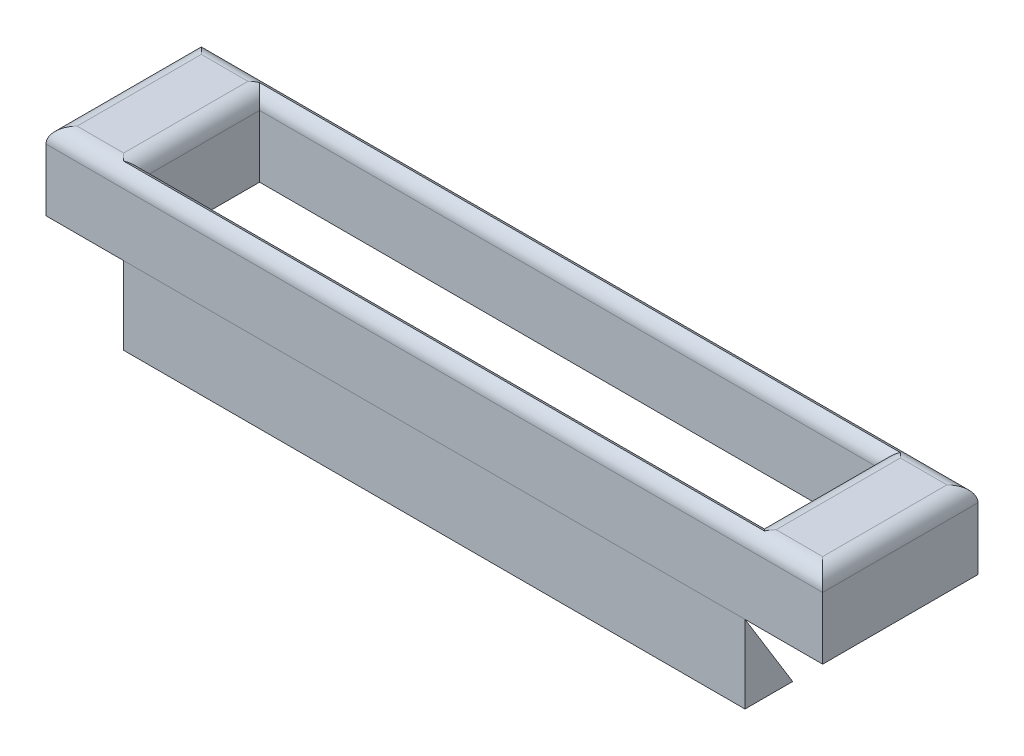
ISO-10303-21;
HEADER;
FILE_DESCRIPTION(('STEP AP214'),'2;1');
FILE_NAME('part.step','',(''),(''),'','','');
FILE_SCHEMA(('AUTOMOTIVE_DESIGN { 1 0 10303 214 1 1 1 1 }'));
ENDSEC;
DATA;
#1=APPLICATION_CONTEXT('core data for automotive mechanical design processes');
#2=APPLICATION_PROTOCOL_DEFINITION('international standard','automotive_design',2000,#1);
#3=PRODUCT_CONTEXT('',#1,'mechanical');
#4=PRODUCT('Part','Part','',(#3));
#5=PRODUCT_RELATED_PRODUCT_CATEGORY('part','',(#4));
#6=PRODUCT_DEFINITION_FORMATION('','',#4);
#7=PRODUCT_DEFINITION_CONTEXT('part definition',#1,'design');
#8=PRODUCT_DEFINITION('design','',#6,#7);
#9=PRODUCT_DEFINITION_SHAPE('','',#8);
#10=(LENGTH_UNIT() NAMED_UNIT(*) SI_UNIT(.MILLI.,.METRE.));
#11=(NAMED_UNIT(*) PLANE_ANGLE_UNIT() SI_UNIT($,.RADIAN.));
#12=(NAMED_UNIT(*) SI_UNIT($,.STERADIAN.) SOLID_ANGLE_UNIT());
#13=UNCERTAINTY_MEASURE_WITH_UNIT(LENGTH_MEASURE(1.E-05),#10,'distance_accuracy_value','');
#14=(GEOMETRIC_REPRESENTATION_CONTEXT(3) GLOBAL_UNCERTAINTY_ASSIGNED_CONTEXT((#13)) GLOBAL_UNIT_ASSIGNED_CONTEXT((#10,
#11,#12)) REPRESENTATION_CONTEXT('',''));
#15=CARTESIAN_POINT('',(0.,0.,0.));
#16=DIRECTION('',(0.,0.,1.));
#17=DIRECTION('',(1.,0.,0.));
#18=AXIS2_PLACEMENT_3D('',#15,#16,#17);
#19=CARTESIAN_POINT('',(0.,10.,0.));
#20=DIRECTION('',(0.,-1.,0.));
#21=DIRECTION('',(0.,0.,-1.));
#22=AXIS2_PLACEMENT_3D('',#19,#20,#21);
#23=PLANE('',#22);
#24=DIRECTION('',(0.,0.,1.));
#25=VECTOR('',#24,1.);
#26=CARTESIAN_POINT('',(-48.,10.,1.19533527696792));
#27=LINE('',#26,#25);
#28=CARTESIAN_POINT('',(-48.,10.,-16.8046647230321));
#29=VERTEX_POINT('',#28);
#30=CARTESIAN_POINT('',(-48.,10.,-0.804664723032077));
#31=VERTEX_POINT('',#30);
#32=EDGE_CURVE('E231',#29,#31,#27,.T.);
#33=ORIENTED_EDGE('',*,*,#32,.T.);
#34=DIRECTION('',(1.,0.,0.));
#35=VECTOR('',#34,1.);
#36=CARTESIAN_POINT('',(50.,10.,-0.804664723032084));
#37=LINE('',#36,#35);
#38=CARTESIAN_POINT('',(-42.,10.,-0.80466472303208));
#39=VERTEX_POINT('',#38);
#40=EDGE_CURVE('E233',#31,#39,#37,.T.);
#41=ORIENTED_EDGE('',*,*,#40,.T.);
#42=DIRECTION('',(0.,0.,1.));
#43=VECTOR('',#42,1.);
#44=CARTESIAN_POINT('',(-42.,10.,0.));
#45=LINE('',#44,#43);
#46=CARTESIAN_POINT('',(-42.,10.,-16.8046647230321));
#47=VERTEX_POINT('',#46);
#48=EDGE_CURVE('E227',#39,#47,#45,.F.);
#49=ORIENTED_EDGE('',*,*,#48,.T.);
#50=DIRECTION('',(-1.,0.,0.));
#51=VECTOR('',#50,1.);
#52=CARTESIAN_POINT('',(-50.,10.,-16.8046647230321));
#53=LINE('',#52,#51);
#54=EDGE_CURVE('E229',#47,#29,#53,.T.);
#55=ORIENTED_EDGE('',*,*,#54,.T.);
#56=EDGE_LOOP('',(#33,#41,#49,#55));
#57=FACE_BOUND('',#56,.T.);
#58=ADVANCED_FACE('F43',(#57),#23,.F.);
#59=CARTESIAN_POINT('',(50.,-10.,1.19533527696792));
#60=DIRECTION('',(1.,0.,0.));
#61=DIRECTION('',(0.,0.,-1.));
#62=AXIS2_PLACEMENT_3D('',#59,#60,#61);
#63=PLANE('',#62);
#64=DIRECTION('',(0.,1.,0.));
#65=VECTOR('',#64,1.);
#66=CARTESIAN_POINT('',(50.,-10.,-18.8046647230321));
#67=LINE('',#66,#65);
#68=CARTESIAN_POINT('',(50.,0.,-18.8046647230321));
#69=VERTEX_POINT('',#68);
#70=CARTESIAN_POINT('',(50.,8.,-18.8046647230321));
#71=VERTEX_POINT('',#70);
#72=EDGE_CURVE('E195',#69,#71,#67,.T.);
#73=ORIENTED_EDGE('',*,*,#72,.T.);
#74=DIRECTION('',(0.,0.,-1.));
#75=VECTOR('',#74,1.);
#76=CARTESIAN_POINT('',(50.,8.,1.19533527696792));
#77=LINE('',#76,#75);
#78=CARTESIAN_POINT('',(50.,8.,1.19533527696792));
#79=VERTEX_POINT('',#78);
#80=EDGE_CURVE('E180',#71,#79,#77,.F.);
#81=ORIENTED_EDGE('',*,*,#80,.T.);
#82=DIRECTION('',(0.,1.,0.));
#83=VECTOR('',#82,1.);
#84=CARTESIAN_POINT('',(50.,-10.,1.19533527696792));
#85=LINE('',#84,#83);
#86=CARTESIAN_POINT('',(50.,0.,1.19533527696792));
#87=VERTEX_POINT('',#86);
#88=EDGE_CURVE('E209',#87,#79,#85,.T.);
#89=ORIENTED_EDGE('',*,*,#88,.F.);
#90=DIRECTION('',(0.,0.,1.));
#91=VECTOR('',#90,1.);
#92=CARTESIAN_POINT('',(50.,0.,1.19533527696792));
#93=LINE('',#92,#91);
#94=EDGE_CURVE('E206',#69,#87,#93,.T.);
#95=ORIENTED_EDGE('',*,*,#94,.F.);
#96=EDGE_LOOP('',(#73,#81,#89,#95));
#97=FACE_BOUND('',#96,.T.);
#98=ADVANCED_FACE('F289',(#97),#63,.T.);
#99=CARTESIAN_POINT('',(-50.,-10.,1.19533527696792));
#100=DIRECTION('',(0.,0.,1.));
#101=DIRECTION('',(1.,0.,0.));
#102=AXIS2_PLACEMENT_3D('',#99,#100,#101);
#103=PLANE('',#102);
#104=ORIENTED_EDGE('',*,*,#88,.T.);
#105=DIRECTION('',(1.,0.,0.));
#106=VECTOR('',#105,1.);
#107=CARTESIAN_POINT('',(-50.,8.,1.19533527696792));
#108=LINE('',#107,#106);
#109=CARTESIAN_POINT('',(-50.,8.,1.19533527696792));
#110=VERTEX_POINT('',#109);
#111=EDGE_CURVE('E236',#79,#110,#108,.F.);
#112=ORIENTED_EDGE('',*,*,#111,.T.);
#113=DIRECTION('',(0.,1.,0.));
#114=VECTOR('',#113,1.);
#115=CARTESIAN_POINT('',(-50.,-10.,1.19533527696792));
#116=LINE('',#115,#114);
#117=CARTESIAN_POINT('',(-50.,0.,1.19533527696792));
#118=VERTEX_POINT('',#117);
#119=EDGE_CURVE('E204',#118,#110,#116,.T.);
#120=ORIENTED_EDGE('',*,*,#119,.F.);
#121=DIRECTION('',(1.,0.,0.));
#122=VECTOR('',#121,1.);
#123=CARTESIAN_POINT('',(-72.3606797749979,0.,1.19533527696792));
#124=LINE('',#123,#122);
#125=EDGE_CURVE('E199',#118,#87,#124,.T.);
#126=ORIENTED_EDGE('',*,*,#125,.T.);
#127=EDGE_LOOP('',(#104,#112,#120,#126));
#128=FACE_BOUND('',#127,.T.);
#129=ADVANCED_FACE('F295',(#128),#103,.T.);
#130=CARTESIAN_POINT('',(-50.,-10.,1.19533527696792));
#131=DIRECTION('',(-1.,0.,0.));
#132=DIRECTION('',(0.,0.,1.));
#133=AXIS2_PLACEMENT_3D('',#130,#131,#132);
#134=PLANE('',#133);
#135=ORIENTED_EDGE('',*,*,#119,.T.);
#136=DIRECTION('',(0.,0.,1.));
#137=VECTOR('',#136,1.);
#138=CARTESIAN_POINT('',(-50.,8.,-18.8046647230321));
#139=LINE('',#138,#137);
#140=CARTESIAN_POINT('',(-50.,8.,-18.8046647230321));
#141=VERTEX_POINT('',#140);
#142=EDGE_CURVE('E239',#110,#141,#139,.F.);
#143=ORIENTED_EDGE('',*,*,#142,.T.);
#144=DIRECTION('',(0.,1.,0.));
#145=VECTOR('',#144,1.);
#146=CARTESIAN_POINT('',(-50.,-10.,-18.8046647230321));
#147=LINE('',#146,#145);
#148=CARTESIAN_POINT('',(-50.,0.,-18.8046647230321));
#149=VERTEX_POINT('',#148);
#150=EDGE_CURVE('E200',#149,#141,#147,.T.);
#151=ORIENTED_EDGE('',*,*,#150,.F.);
#152=DIRECTION('',(0.,0.,1.));
#153=VECTOR('',#152,1.);
#154=CARTESIAN_POINT('',(-50.,0.,1.19533527696792));
#155=LINE('',#154,#153);
#156=EDGE_CURVE('E210',#149,#118,#155,.T.);
#157=ORIENTED_EDGE('',*,*,#156,.T.);
#158=EDGE_LOOP('',(#135,#143,#151,#157));
#159=FACE_BOUND('',#158,.T.);
#160=ADVANCED_FACE('F298',(#159),#134,.T.);
#161=CARTESIAN_POINT('',(-50.,-10.,-18.8046647230321));
#162=DIRECTION('',(0.,0.,-1.));
#163=DIRECTION('',(-1.,0.,0.));
#164=AXIS2_PLACEMENT_3D('',#161,#162,#163);
#165=PLANE('',#164);
#166=ORIENTED_EDGE('',*,*,#150,.T.);
#167=DIRECTION('',(-1.,0.,0.));
#168=VECTOR('',#167,1.);
#169=CARTESIAN_POINT('',(50.,8.,-18.8046647230321));
#170=LINE('',#169,#168);
#171=EDGE_CURVE('E241',#141,#71,#170,.F.);
#172=ORIENTED_EDGE('',*,*,#171,.T.);
#173=ORIENTED_EDGE('',*,*,#72,.F.);
#174=DIRECTION('',(1.,0.,0.));
#175=VECTOR('',#174,1.);
#176=CARTESIAN_POINT('',(-72.3606797749979,0.,-18.8046647230321));
#177=LINE('',#176,#175);
#178=EDGE_CURVE('E203',#149,#69,#177,.T.);
#179=ORIENTED_EDGE('',*,*,#178,.F.);
#180=EDGE_LOOP('',(#166,#172,#173,#179));
#181=FACE_BOUND('',#180,.T.);
#182=ADVANCED_FACE('F284',(#181),#165,.T.);
#183=DIRECTION('',(1.,0.,0.));
#184=VECTOR('',#183,1.);
#185=CARTESIAN_POINT('',(50.,10.,-0.804664723032084));
#186=LINE('',#185,#184);
#187=CARTESIAN_POINT('',(42.,10.,-0.80466472303208));
#188=VERTEX_POINT('',#187);
#189=CARTESIAN_POINT('',(48.,10.,-0.804664723032084));
#190=VERTEX_POINT('',#189);
#191=EDGE_CURVE('E222',#188,#190,#186,.T.);
#192=ORIENTED_EDGE('',*,*,#191,.T.);
#193=DIRECTION('',(0.,0.,-1.));
#194=VECTOR('',#193,1.);
#195=CARTESIAN_POINT('',(48.,10.,-18.8046647230321));
#196=LINE('',#195,#194);
#197=CARTESIAN_POINT('',(48.,10.,-16.8046647230321));
#198=VERTEX_POINT('',#197);
#199=EDGE_CURVE('E225',#190,#198,#196,.T.);
#200=ORIENTED_EDGE('',*,*,#199,.T.);
#201=DIRECTION('',(-1.,0.,0.));
#202=VECTOR('',#201,1.);
#203=CARTESIAN_POINT('',(-50.,10.,-16.8046647230321));
#204=LINE('',#203,#202);
#205=CARTESIAN_POINT('',(42.,10.,-16.8046647230321));
#206=VERTEX_POINT('',#205);
#207=EDGE_CURVE('E220',#198,#206,#204,.T.);
#208=ORIENTED_EDGE('',*,*,#207,.T.);
#209=DIRECTION('',(0.,0.,-1.));
#210=VECTOR('',#209,1.);
#211=CARTESIAN_POINT('',(42.,10.,0.));
#212=LINE('',#211,#210);
#213=EDGE_CURVE('E214',#206,#188,#212,.F.);
#214=ORIENTED_EDGE('',*,*,#213,.T.);
#215=EDGE_LOOP('',(#192,#200,#208,#214));
#216=FACE_BOUND('',#215,.T.);
#217=ADVANCED_FACE('F305',(#216),#23,.F.);
#218=CARTESIAN_POINT('',(-72.3606797749979,0.,1.19533527696792));
#219=DIRECTION('',(0.,1.,0.));
#220=DIRECTION('',(0.,0.,1.));
#221=AXIS2_PLACEMENT_3D('',#218,#219,#220);
#222=PLANE('',#221);
#223=DIRECTION('',(-1.,0.,0.));
#224=VECTOR('',#223,1.);
#225=CARTESIAN_POINT('',(-40.,0.,-1.30466472303208));
#226=LINE('',#225,#224);
#227=CARTESIAN_POINT('',(40.,0.,-1.30466472303209));
#228=VERTEX_POINT('',#227);
#229=CARTESIAN_POINT('',(-40.,0.,-1.30466472303208));
#230=VERTEX_POINT('',#229);
#231=EDGE_CURVE('E184',#228,#230,#226,.T.);
#232=ORIENTED_EDGE('',*,*,#231,.F.);
#233=DIRECTION('',(0.,0.,1.));
#234=VECTOR('',#233,1.);
#235=CARTESIAN_POINT('',(40.,0.,-16.3046647230321));
#236=LINE('',#235,#234);
#237=CARTESIAN_POINT('',(40.,0.,-16.3046647230321));
#238=VERTEX_POINT('',#237);
#239=EDGE_CURVE('E196',#238,#228,#236,.T.);
#240=ORIENTED_EDGE('',*,*,#239,.F.);
#241=DIRECTION('',(1.,0.,0.));
#242=VECTOR('',#241,1.);
#243=CARTESIAN_POINT('',(-40.,0.,-16.3046647230321));
#244=LINE('',#243,#242);
#245=CARTESIAN_POINT('',(-40.,0.,-16.3046647230321));
#246=VERTEX_POINT('',#245);
#247=EDGE_CURVE('E89',#246,#238,#244,.T.);
#248=ORIENTED_EDGE('',*,*,#247,.F.);
#249=DIRECTION('',(0.,0.,-1.));
#250=VECTOR('',#249,1.);
#251=CARTESIAN_POINT('',(-40.,0.,-16.3046647230321));
#252=LINE('',#251,#250);
#253=EDGE_CURVE('E187',#230,#246,#252,.T.);
#254=ORIENTED_EDGE('',*,*,#253,.F.);
#255=EDGE_LOOP('',(#232,#240,#248,#254));
#256=FACE_BOUND('',#255,.T.);
#257=ORIENTED_EDGE('',*,*,#178,.T.);
#258=ORIENTED_EDGE('',*,*,#94,.T.);
#259=ORIENTED_EDGE('',*,*,#125,.F.);
#260=ORIENTED_EDGE('',*,*,#156,.F.);
#261=EDGE_LOOP('',(#257,#258,#259,#260));
#262=FACE_BOUND('',#261,.T.);
#263=ADVANCED_FACE('F292',(#256,#262),#222,.F.);
#264=CARTESIAN_POINT('',(40.,-81.3941029804985,-16.3046647230321));
#265=DIRECTION('',(1.,0.,0.));
#266=DIRECTION('',(0.,0.,-1.));
#267=AXIS2_PLACEMENT_3D('',#264,#265,#266);
#268=PLANE('',#267);
#269=DIRECTION('',(0.,1.,0.));
#270=VECTOR('',#269,1.);
#271=CARTESIAN_POINT('',(40.,-81.3941029804985,-1.30466472303209));
#272=LINE('',#271,#270);
#273=CARTESIAN_POINT('',(40.,8.00000000000001,-1.30466472303209));
#274=VERTEX_POINT('',#273);
#275=EDGE_CURVE('E185',#228,#274,#272,.T.);
#276=ORIENTED_EDGE('',*,*,#275,.T.);
#277=DIRECTION('',(0.,0.,-1.));
#278=VECTOR('',#277,1.);
#279=CARTESIAN_POINT('',(40.,8.00000000000001,-16.3046647230321));
#280=LINE('',#279,#278);
#281=CARTESIAN_POINT('',(40.,8.00000000000001,-16.3046647230321));
#282=VERTEX_POINT('',#281);
#283=EDGE_CURVE('E53',#274,#282,#280,.T.);
#284=ORIENTED_EDGE('',*,*,#283,.T.);
#285=DIRECTION('',(0.,1.,0.));
#286=VECTOR('',#285,1.);
#287=CARTESIAN_POINT('',(40.,-81.3941029804985,-16.3046647230321));
#288=LINE('',#287,#286);
#289=EDGE_CURVE('E189',#238,#282,#288,.T.);
#290=ORIENTED_EDGE('',*,*,#289,.F.);
#291=ORIENTED_EDGE('',*,*,#239,.T.);
#292=EDGE_LOOP('',(#276,#284,#290,#291));
#293=FACE_BOUND('',#292,.T.);
#294=ADVANCED_FACE('F321',(#293),#268,.F.);
#295=CARTESIAN_POINT('',(-40.,-81.3941029804985,-1.30466472303208));
#296=DIRECTION('',(0.,0.,1.));
#297=DIRECTION('',(1.,0.,0.));
#298=AXIS2_PLACEMENT_3D('',#295,#296,#297);
#299=PLANE('',#298);
#300=DIRECTION('',(0.,1.,0.));
#301=VECTOR('',#300,1.);
#302=CARTESIAN_POINT('',(-40.,-81.3941029804985,-1.30466472303208));
#303=LINE('',#302,#301);
#304=CARTESIAN_POINT('',(-40.,8.00000000000001,-1.30466472303208));
#305=VERTEX_POINT('',#304);
#306=EDGE_CURVE('E177',#230,#305,#303,.T.);
#307=ORIENTED_EDGE('',*,*,#306,.T.);
#308=DIRECTION('',(1.,0.,0.));
#309=VECTOR('',#308,1.);
#310=CARTESIAN_POINT('',(-40.,8.00000000000001,-1.30466472303208));
#311=LINE('',#310,#309);
#312=EDGE_CURVE('E150',#305,#274,#311,.T.);
#313=ORIENTED_EDGE('',*,*,#312,.T.);
#314=ORIENTED_EDGE('',*,*,#275,.F.);
#315=ORIENTED_EDGE('',*,*,#231,.T.);
#316=EDGE_LOOP('',(#307,#313,#314,#315));
#317=FACE_BOUND('',#316,.T.);
#318=ADVANCED_FACE('F182',(#317),#299,.F.);
#319=CARTESIAN_POINT('',(-40.,-81.3941029804985,-16.3046647230321));
#320=DIRECTION('',(-1.,0.,0.));
#321=DIRECTION('',(0.,0.,1.));
#322=AXIS2_PLACEMENT_3D('',#319,#320,#321);
#323=PLANE('',#322);
#324=DIRECTION('',(0.,1.,0.));
#325=VECTOR('',#324,1.);
#326=CARTESIAN_POINT('',(-40.,-81.3941029804985,-16.3046647230321));
#327=LINE('',#326,#325);
#328=CARTESIAN_POINT('',(-40.,8.00000000000001,-16.3046647230321));
#329=VERTEX_POINT('',#328);
#330=EDGE_CURVE('E179',#246,#329,#327,.T.);
#331=ORIENTED_EDGE('',*,*,#330,.T.);
#332=DIRECTION('',(0.,0.,1.));
#333=VECTOR('',#332,1.);
#334=CARTESIAN_POINT('',(-40.,8.00000000000001,-16.3046647230321));
#335=LINE('',#334,#333);
#336=EDGE_CURVE('E160',#329,#305,#335,.T.);
#337=ORIENTED_EDGE('',*,*,#336,.T.);
#338=ORIENTED_EDGE('',*,*,#306,.F.);
#339=ORIENTED_EDGE('',*,*,#253,.T.);
#340=EDGE_LOOP('',(#331,#337,#338,#339));
#341=FACE_BOUND('',#340,.T.);
#342=ADVANCED_FACE('F175',(#341),#323,.F.);
#343=CARTESIAN_POINT('',(-40.,-81.3941029804985,-16.3046647230321));
#344=DIRECTION('',(0.,0.,-1.));
#345=DIRECTION('',(-1.,0.,0.));
#346=AXIS2_PLACEMENT_3D('',#343,#344,#345);
#347=PLANE('',#346);
#348=ORIENTED_EDGE('',*,*,#289,.T.);
#349=DIRECTION('',(-1.,0.,0.));
#350=VECTOR('',#349,1.);
#351=CARTESIAN_POINT('',(-40.,8.00000000000001,-16.3046647230321));
#352=LINE('',#351,#350);
#353=EDGE_CURVE('E12',#282,#329,#352,.T.);
#354=ORIENTED_EDGE('',*,*,#353,.T.);
#355=ORIENTED_EDGE('',*,*,#330,.F.);
#356=ORIENTED_EDGE('',*,*,#247,.T.);
#357=EDGE_LOOP('',(#348,#354,#355,#356));
#358=FACE_BOUND('',#357,.T.);
#359=ADVANCED_FACE('F352',(#358),#347,.F.);
#360=CARTESIAN_POINT('',(-40.,8.00000000000001,-18.3046647230321));
#361=DIRECTION('',(-1.,0.,0.));
#362=DIRECTION('',(0.,0.,1.));
#363=AXIS2_PLACEMENT_3D('',#360,#361,#362);
#364=CYLINDRICAL_SURFACE('',#363,2.);
#365=DIRECTION('',(-1.,0.,0.));
#366=VECTOR('',#365,1.);
#367=CARTESIAN_POINT('',(0.,9.85404962177392,-17.5546647230321));
#368=LINE('',#367,#366);
#369=CARTESIAN_POINT('',(-41.25,9.85404962177392,-17.5546647230321));
#370=VERTEX_POINT('',#369);
#371=CARTESIAN_POINT('',(41.25,9.85404962177392,-17.5546647230321));
#372=VERTEX_POINT('',#371);
#373=EDGE_CURVE('E47',#370,#372,#368,.F.);
#374=ORIENTED_EDGE('',*,*,#373,.F.);
#375=CARTESIAN_POINT('',(-42.,8.00000000000001,-18.3046647230321));
#376=DIRECTION('',(-0.707106781186547,0.,0.707106781186548));
#377=DIRECTION('',(0.707106781186548,0.,0.707106781186547));
#378=AXIS2_PLACEMENT_3D('',#375,#376,#377);
#379=ELLIPSE('',#378,2.82842712474619,2.);
#380=EDGE_CURVE('E170',#329,#370,#379,.T.);
#381=ORIENTED_EDGE('',*,*,#380,.F.);
#382=ORIENTED_EDGE('',*,*,#353,.F.);
#383=CARTESIAN_POINT('',(42.,8.00000000000001,-18.3046647230321));
#384=DIRECTION('',(-0.707106781186548,0.,-0.707106781186547));
#385=DIRECTION('',(0.707106781186547,0.,-0.707106781186548));
#386=AXIS2_PLACEMENT_3D('',#383,#384,#385);
#387=ELLIPSE('',#386,2.82842712474619,2.);
#388=EDGE_CURVE('E261',#372,#282,#387,.F.);
#389=ORIENTED_EDGE('',*,*,#388,.F.);
#390=EDGE_LOOP('',(#374,#381,#382,#389));
#391=FACE_BOUND('',#390,.T.);
#392=ADVANCED_FACE('F45',(#391),#364,.T.);
#393=CARTESIAN_POINT('',(0.,8.,-16.8046647230321));
#394=DIRECTION('',(1.,0.,0.));
#395=DIRECTION('',(0.,0.,-1.));
#396=AXIS2_PLACEMENT_3D('',#393,#394,#395);
#397=CYLINDRICAL_SURFACE('',#396,2.);
#398=CARTESIAN_POINT('',(48.,8.,-16.8046647230321));
#399=DIRECTION('',(0.707106781186547,0.,0.707106781186547));
#400=DIRECTION('',(-0.707106781186547,0.,0.707106781186547));
#401=AXIS2_PLACEMENT_3D('',#398,#399,#400);
#402=ELLIPSE('',#401,2.82842712474619,2.);
#403=EDGE_CURVE('E255',#71,#198,#402,.T.);
#404=ORIENTED_EDGE('',*,*,#403,.F.);
#405=ORIENTED_EDGE('',*,*,#171,.F.);
#406=CARTESIAN_POINT('',(-48.,8.,-16.8046647230321));
#407=DIRECTION('',(0.707106781186547,0.,-0.707106781186547));
#408=DIRECTION('',(0.707106781186547,0.,0.707106781186547));
#409=AXIS2_PLACEMENT_3D('',#406,#407,#408);
#410=ELLIPSE('',#409,2.82842712474619,2.);
#411=EDGE_CURVE('E268',#29,#141,#410,.F.);
#412=ORIENTED_EDGE('',*,*,#411,.F.);
#413=ORIENTED_EDGE('',*,*,#54,.F.);
#414=CARTESIAN_POINT('',(-42.,8.,-16.8046647230321));
#415=DIRECTION('',(0.707106781186547,0.,0.707106781186547));
#416=DIRECTION('',(0.707106781186547,0.,-0.707106781186547));
#417=AXIS2_PLACEMENT_3D('',#414,#415,#416);
#418=ELLIPSE('',#417,2.82842712474619,2.);
#419=EDGE_CURVE('E266',#370,#47,#418,.T.);
#420=ORIENTED_EDGE('',*,*,#419,.F.);
#421=ORIENTED_EDGE('',*,*,#373,.T.);
#422=CARTESIAN_POINT('',(42.,8.,-16.8046647230321));
#423=DIRECTION('',(0.707106781186547,0.,-0.707106781186547));
#424=DIRECTION('',(0.707106781186547,0.,0.707106781186547));
#425=AXIS2_PLACEMENT_3D('',#422,#423,#424);
#426=ELLIPSE('',#425,2.82842712474619,2.);
#427=EDGE_CURVE('E258',#206,#372,#426,.F.);
#428=ORIENTED_EDGE('',*,*,#427,.F.);
#429=ORIENTED_EDGE('',*,*,#207,.F.);
#430=EDGE_LOOP('',(#404,#405,#412,#413,#420,#421,#428,#429));
#431=FACE_BOUND('',#430,.T.);
#432=ADVANCED_FACE('F279',(#431),#397,.T.);
#433=CARTESIAN_POINT('',(-48.,8.,0.));
#434=DIRECTION('',(0.,0.,-1.));
#435=DIRECTION('',(-1.,0.,0.));
#436=AXIS2_PLACEMENT_3D('',#433,#434,#435);
#437=CYLINDRICAL_SURFACE('',#436,2.);
#438=ORIENTED_EDGE('',*,*,#411,.T.);
#439=ORIENTED_EDGE('',*,*,#142,.F.);
#440=CARTESIAN_POINT('',(-48.,8.,-0.804664723032077));
#441=DIRECTION('',(-0.707106781186548,0.,-0.707106781186547));
#442=DIRECTION('',(0.707106781186547,0.,-0.707106781186547));
#443=AXIS2_PLACEMENT_3D('',#440,#441,#442);
#444=ELLIPSE('',#443,2.82842712474619,2.);
#445=EDGE_CURVE('E253',#31,#110,#444,.F.);
#446=ORIENTED_EDGE('',*,*,#445,.F.);
#447=ORIENTED_EDGE('',*,*,#32,.F.);
#448=EDGE_LOOP('',(#438,#439,#446,#447));
#449=FACE_BOUND('',#448,.T.);
#450=ADVANCED_FACE('F274',(#449),#437,.T.);
#451=CARTESIAN_POINT('',(-42.,8.00000000000001,-16.3046647230321));
#452=DIRECTION('',(0.,0.,1.));
#453=DIRECTION('',(1.,0.,0.));
#454=AXIS2_PLACEMENT_3D('',#451,#452,#453);
#455=CYLINDRICAL_SURFACE('',#454,2.);
#456=CARTESIAN_POINT('',(-42.,8.00000000000001,0.69533527696792));
#457=DIRECTION('',(0.707106781186548,0.,0.707106781186547));
#458=DIRECTION('',(-0.707106781186547,0.,0.707106781186548));
#459=AXIS2_PLACEMENT_3D('',#456,#457,#458);
#460=ELLIPSE('',#459,2.82842712474619,2.);
#461=CARTESIAN_POINT('',(-41.25,9.85404962177392,-0.0546647230320859));
#462=VERTEX_POINT('',#461);
#463=EDGE_CURVE('E154',#305,#462,#460,.T.);
#464=ORIENTED_EDGE('',*,*,#463,.F.);
#465=ORIENTED_EDGE('',*,*,#336,.F.);
#466=ORIENTED_EDGE('',*,*,#380,.T.);
#467=ORIENTED_EDGE('',*,*,#419,.T.);
#468=ORIENTED_EDGE('',*,*,#48,.F.);
#469=CARTESIAN_POINT('',(-42.,8.,-0.804664723032077));
#470=DIRECTION('',(-0.707106781186547,0.,0.707106781186547));
#471=DIRECTION('',(-0.707106781186548,0.,-0.707106781186547));
#472=AXIS2_PLACEMENT_3D('',#469,#470,#471);
#473=ELLIPSE('',#472,2.82842712474619,2.);
#474=EDGE_CURVE('E168',#462,#39,#473,.T.);
#475=ORIENTED_EDGE('',*,*,#474,.F.);
#476=EDGE_LOOP('',(#464,#465,#466,#467,#468,#475));
#477=FACE_BOUND('',#476,.T.);
#478=ADVANCED_FACE('F165',(#477),#455,.T.);
#479=CARTESIAN_POINT('',(-40.,8.00000000000001,0.69533527696792));
#480=DIRECTION('',(1.,0.,0.));
#481=DIRECTION('',(0.,0.,-1.));
#482=AXIS2_PLACEMENT_3D('',#479,#480,#481);
#483=CYLINDRICAL_SURFACE('',#482,2.);
#484=CARTESIAN_POINT('',(42.,8.00000000000001,0.69533527696791));
#485=DIRECTION('',(0.707106781186547,0.,-0.707106781186548));
#486=DIRECTION('',(0.707106781186548,0.,0.707106781186547));
#487=AXIS2_PLACEMENT_3D('',#484,#485,#486);
#488=ELLIPSE('',#487,2.82842712474619,2.);
#489=CARTESIAN_POINT('',(41.25,9.85404962177392,-0.0546647230320871));
#490=VERTEX_POINT('',#489);
#491=EDGE_CURVE('E156',#274,#490,#488,.T.);
#492=ORIENTED_EDGE('',*,*,#491,.F.);
#493=ORIENTED_EDGE('',*,*,#312,.F.);
#494=ORIENTED_EDGE('',*,*,#463,.T.);
#495=DIRECTION('',(1.,0.,0.));
#496=VECTOR('',#495,1.);
#497=CARTESIAN_POINT('',(0.,9.85404962177392,-0.054664723032091));
#498=LINE('',#497,#496);
#499=EDGE_CURVE('E250',#490,#462,#498,.F.);
#500=ORIENTED_EDGE('',*,*,#499,.F.);
#501=EDGE_LOOP('',(#492,#493,#494,#500));
#502=FACE_BOUND('',#501,.T.);
#503=ADVANCED_FACE('F152',(#502),#483,.T.);
#504=CARTESIAN_POINT('',(42.,8.00000000000001,-16.3046647230321));
#505=DIRECTION('',(0.,0.,-1.));
#506=DIRECTION('',(-1.,0.,0.));
#507=AXIS2_PLACEMENT_3D('',#504,#505,#506);
#508=CYLINDRICAL_SURFACE('',#507,2.);
#509=ORIENTED_EDGE('',*,*,#283,.F.);
#510=ORIENTED_EDGE('',*,*,#491,.T.);
#511=CARTESIAN_POINT('',(42.,8.,-0.804664723032084));
#512=DIRECTION('',(-0.707106781186548,0.,-0.707106781186547));
#513=DIRECTION('',(-0.707106781186547,0.,0.707106781186547));
#514=AXIS2_PLACEMENT_3D('',#511,#512,#513);
#515=ELLIPSE('',#514,2.82842712474619,2.);
#516=EDGE_CURVE('E247',#188,#490,#515,.F.);
#517=ORIENTED_EDGE('',*,*,#516,.F.);
#518=ORIENTED_EDGE('',*,*,#213,.F.);
#519=ORIENTED_EDGE('',*,*,#427,.T.);
#520=ORIENTED_EDGE('',*,*,#388,.T.);
#521=EDGE_LOOP('',(#509,#510,#517,#518,#519,#520));
#522=FACE_BOUND('',#521,.T.);
#523=ADVANCED_FACE('F333',(#522),#508,.T.);
#524=CARTESIAN_POINT('',(48.,8.,0.));
#525=DIRECTION('',(0.,0.,1.));
#526=DIRECTION('',(1.,0.,0.));
#527=AXIS2_PLACEMENT_3D('',#524,#525,#526);
#528=CYLINDRICAL_SURFACE('',#527,2.);
#529=ORIENTED_EDGE('',*,*,#403,.T.);
#530=ORIENTED_EDGE('',*,*,#199,.F.);
#531=CARTESIAN_POINT('',(48.,8.,-0.804664723032084));
#532=DIRECTION('',(-0.707106781186547,0.,0.707106781186547));
#533=DIRECTION('',(0.707106781186548,0.,0.707106781186547));
#534=AXIS2_PLACEMENT_3D('',#531,#532,#533);
#535=ELLIPSE('',#534,2.82842712474619,2.);
#536=EDGE_CURVE('E245',#79,#190,#535,.T.);
#537=ORIENTED_EDGE('',*,*,#536,.F.);
#538=ORIENTED_EDGE('',*,*,#80,.F.);
#539=EDGE_LOOP('',(#529,#530,#537,#538));
#540=FACE_BOUND('',#539,.T.);
#541=ADVANCED_FACE('F331',(#540),#528,.T.);
#542=CARTESIAN_POINT('',(0.,8.,-0.80466472303208));
#543=DIRECTION('',(-1.,0.,0.));
#544=DIRECTION('',(0.,0.,1.));
#545=AXIS2_PLACEMENT_3D('',#542,#543,#544);
#546=CYLINDRICAL_SURFACE('',#545,2.);
#547=ORIENTED_EDGE('',*,*,#445,.T.);
#548=ORIENTED_EDGE('',*,*,#111,.F.);
#549=ORIENTED_EDGE('',*,*,#536,.T.);
#550=ORIENTED_EDGE('',*,*,#191,.F.);
#551=ORIENTED_EDGE('',*,*,#516,.T.);
#552=ORIENTED_EDGE('',*,*,#499,.T.);
#553=ORIENTED_EDGE('',*,*,#474,.T.);
#554=ORIENTED_EDGE('',*,*,#40,.F.);
#555=EDGE_LOOP('',(#547,#548,#549,#550,#551,#552,#553,#554));
#556=FACE_BOUND('',#555,.T.);
#557=ADVANCED_FACE('F328',(#556),#546,.T.);
#558=CLOSED_SHELL('',(#58,#98,#129,#160,#182,#217,#263,#294,#318,#342,#359,#392,#432,#450,#478,
#503,#523,#541,#557));
#559=MANIFOLD_SOLID_BREP('B2',#558);
#560=CARTESIAN_POINT('',(0.,-10.,0.));
#561=DIRECTION('',(0.,-1.,0.));
#562=DIRECTION('',(0.,0.,-1.));
#563=AXIS2_PLACEMENT_3D('',#560,#561,#562);
#564=PLANE('',#563);
#565=DIRECTION('',(-1.,0.,0.));
#566=VECTOR('',#565,1.);
#567=CARTESIAN_POINT('',(62.3606797749979,-10.,-4.94437074633024));
#568=LINE('',#567,#566);
#569=CARTESIAN_POINT('',(40.,-10.,-4.94437074633024));
#570=VERTEX_POINT('',#569);
#571=CARTESIAN_POINT('',(-40.,-10.,-4.94437074633024));
#572=VERTEX_POINT('',#571);
#573=EDGE_CURVE('E510',#570,#572,#568,.T.);
#574=ORIENTED_EDGE('',*,*,#573,.F.);
#575=DIRECTION('',(0.,0.,-1.));
#576=VECTOR('',#575,1.);
#577=CARTESIAN_POINT('',(40.,-10.,-18.8046647230321));
#578=LINE('',#577,#576);
#579=CARTESIAN_POINT('',(40.,-10.,1.19533527696792));
#580=VERTEX_POINT('',#579);
#581=EDGE_CURVE('E524',#580,#570,#578,.T.);
#582=ORIENTED_EDGE('',*,*,#581,.F.);
#583=DIRECTION('',(1.,0.,0.));
#584=VECTOR('',#583,1.);
#585=CARTESIAN_POINT('',(-50.,-10.,1.19533527696792));
#586=LINE('',#585,#584);
#587=CARTESIAN_POINT('',(-40.,-10.,1.19533527696792));
#588=VERTEX_POINT('',#587);
#589=EDGE_CURVE('E481',#588,#580,#586,.T.);
#590=ORIENTED_EDGE('',*,*,#589,.F.);
#591=DIRECTION('',(0.,0.,1.));
#592=VECTOR('',#591,1.);
#593=CARTESIAN_POINT('',(-40.,-10.,-18.8046647230321));
#594=LINE('',#593,#592);
#595=EDGE_CURVE('E488',#572,#588,#594,.T.);
#596=ORIENTED_EDGE('',*,*,#595,.F.);
#597=EDGE_LOOP('',(#574,#582,#590,#596));
#598=FACE_BOUND('',#597,.T.);
#599=ADVANCED_FACE('F473',(#598),#564,.T.);
#600=CARTESIAN_POINT('',(-50.,-10.,1.19533527696792));
#601=DIRECTION('',(0.,0.,1.));
#602=DIRECTION('',(1.,0.,0.));
#603=AXIS2_PLACEMENT_3D('',#600,#601,#602);
#604=PLANE('',#603);
#605=DIRECTION('',(0.,-1.,0.));
#606=VECTOR('',#605,1.);
#607=CARTESIAN_POINT('',(40.,-10.,1.19533527696792));
#608=LINE('',#607,#606);
#609=CARTESIAN_POINT('',(40.,0.,1.19533527696792));
#610=VERTEX_POINT('',#609);
#611=EDGE_CURVE('E496',#610,#580,#608,.T.);
#612=ORIENTED_EDGE('',*,*,#611,.F.);
#613=DIRECTION('',(1.,0.,0.));
#614=VECTOR('',#613,1.);
#615=CARTESIAN_POINT('',(-50.,0.,1.19533527696792));
#616=LINE('',#615,#614);
#617=CARTESIAN_POINT('',(-40.,0.,1.19533527696792));
#618=VERTEX_POINT('',#617);
#619=EDGE_CURVE('E41',#618,#610,#616,.T.);
#620=ORIENTED_EDGE('',*,*,#619,.F.);
#621=DIRECTION('',(0.,1.,0.));
#622=VECTOR('',#621,1.);
#623=CARTESIAN_POINT('',(-40.,-10.,1.19533527696792));
#624=LINE('',#623,#622);
#625=EDGE_CURVE('E517',#588,#618,#624,.T.);
#626=ORIENTED_EDGE('',*,*,#625,.F.);
#627=ORIENTED_EDGE('',*,*,#589,.T.);
#628=EDGE_LOOP('',(#612,#620,#626,#627));
#629=FACE_BOUND('',#628,.T.);
#630=ADVANCED_FACE('F475',(#629),#604,.T.);
#631=CARTESIAN_POINT('',(-40.,0.,0.));
#632=DIRECTION('',(-1.,0.,0.));
#633=DIRECTION('',(0.,0.,1.));
#634=AXIS2_PLACEMENT_3D('',#631,#632,#633);
#635=PLANE('',#634);
#636=DIRECTION('',(0.,0.852195729383764,0.523223125272646));
#637=VECTOR('',#636,1.);
#638=CARTESIAN_POINT('',(-40.,0.,1.19533527696792));
#639=LINE('',#638,#637);
#640=EDGE_CURVE('E512',#572,#618,#639,.T.);
#641=ORIENTED_EDGE('',*,*,#640,.F.);
#642=ORIENTED_EDGE('',*,*,#595,.T.);
#643=ORIENTED_EDGE('',*,*,#625,.T.);
#644=EDGE_LOOP('',(#641,#642,#643));
#645=FACE_BOUND('',#644,.T.);
#646=ADVANCED_FACE('F516',(#645),#635,.T.);
#647=CARTESIAN_POINT('',(40.,0.,0.));
#648=DIRECTION('',(-1.,0.,0.));
#649=DIRECTION('',(0.,0.,1.));
#650=AXIS2_PLACEMENT_3D('',#647,#648,#649);
#651=PLANE('',#650);
#652=ORIENTED_EDGE('',*,*,#581,.T.);
#653=DIRECTION('',(0.,-0.852195729383764,-0.523223125272646));
#654=VECTOR('',#653,1.);
#655=CARTESIAN_POINT('',(40.,0.,1.19533527696792));
#656=LINE('',#655,#654);
#657=EDGE_CURVE('E513',#610,#570,#656,.T.);
#658=ORIENTED_EDGE('',*,*,#657,.F.);
#659=ORIENTED_EDGE('',*,*,#611,.T.);
#660=EDGE_LOOP('',(#652,#658,#659));
#661=FACE_BOUND('',#660,.T.);
#662=ADVANCED_FACE('F528',(#661),#651,.F.);
#663=CARTESIAN_POINT('',(62.3606797749979,0.,1.19533527696792));
#664=DIRECTION('',(0.,-0.523223125272646,0.852195729383764));
#665=DIRECTION('',(0.,-0.852195729383764,-0.523223125272646));
#666=AXIS2_PLACEMENT_3D('',#663,#664,#665);
#667=PLANE('',#666);
#668=ORIENTED_EDGE('',*,*,#657,.T.);
#669=ORIENTED_EDGE('',*,*,#573,.T.);
#670=ORIENTED_EDGE('',*,*,#640,.T.);
#671=ORIENTED_EDGE('',*,*,#619,.T.);
#672=EDGE_LOOP('',(#668,#669,#670,#671));
#673=FACE_BOUND('',#672,.T.);
#674=ADVANCED_FACE('F511',(#673),#667,.F.);
#675=CLOSED_SHELL('',(#599,#630,#646,#662,#674));
#676=MANIFOLD_SOLID_BREP('B6',#675);
#677=ADVANCED_BREP_SHAPE_REPRESENTATION('',(#18,#559,#676),#14);
#678=SHAPE_DEFINITION_REPRESENTATION(#9,#677);
ENDSEC;
END-ISO-10303-21;
